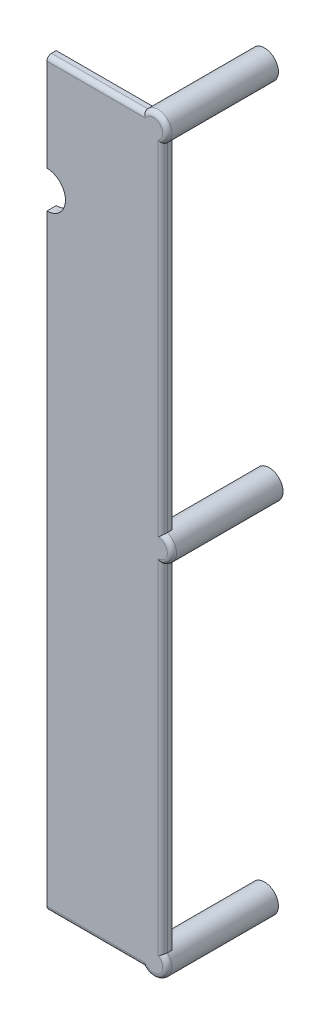
ISO-10303-21;
HEADER;
FILE_DESCRIPTION(('STEP AP214'),'2;1');
FILE_NAME('part.step','',(''),(''),'','','');
FILE_SCHEMA(('AUTOMOTIVE_DESIGN { 1 0 10303 214 1 1 1 1 }'));
ENDSEC;
DATA;
#1=APPLICATION_CONTEXT('core data for automotive mechanical design processes');
#2=APPLICATION_PROTOCOL_DEFINITION('international standard','automotive_design',2000,#1);
#3=PRODUCT_CONTEXT('',#1,'mechanical');
#4=PRODUCT('Part','Part','',(#3));
#5=PRODUCT_RELATED_PRODUCT_CATEGORY('part','',(#4));
#6=PRODUCT_DEFINITION_FORMATION('','',#4);
#7=PRODUCT_DEFINITION_CONTEXT('part definition',#1,'design');
#8=PRODUCT_DEFINITION('design','',#6,#7);
#9=PRODUCT_DEFINITION_SHAPE('','',#8);
#10=(LENGTH_UNIT() NAMED_UNIT(*) SI_UNIT(.MILLI.,.METRE.));
#11=(NAMED_UNIT(*) PLANE_ANGLE_UNIT() SI_UNIT($,.RADIAN.));
#12=(NAMED_UNIT(*) SI_UNIT($,.STERADIAN.) SOLID_ANGLE_UNIT());
#13=UNCERTAINTY_MEASURE_WITH_UNIT(LENGTH_MEASURE(1.E-05),#10,'distance_accuracy_value','');
#14=(GEOMETRIC_REPRESENTATION_CONTEXT(3) GLOBAL_UNCERTAINTY_ASSIGNED_CONTEXT((#13)) GLOBAL_UNIT_ASSIGNED_CONTEXT((#10,
#11,#12)) REPRESENTATION_CONTEXT('',''));
#15=CARTESIAN_POINT('',(0.,0.,0.));
#16=DIRECTION('',(0.,0.,1.));
#17=DIRECTION('',(1.,0.,0.));
#18=AXIS2_PLACEMENT_3D('',#15,#16,#17);
#19=CARTESIAN_POINT('',(2.,2.,50.));
#20=DIRECTION('',(0.,0.,1.));
#21=DIRECTION('',(1.,0.,0.));
#22=AXIS2_PLACEMENT_3D('',#19,#20,#21);
#23=PLANE('',#22);
#24=DIRECTION('',(1.,0.,0.));
#25=VECTOR('',#24,1.);
#26=CARTESIAN_POINT('',(0.,0.,50.));
#27=LINE('',#26,#25);
#28=CARTESIAN_POINT('',(25.,0.,50.));
#29=VERTEX_POINT('',#28);
#30=CARTESIAN_POINT('',(45.7639320225002,0.,50.));
#31=VERTEX_POINT('',#30);
#32=EDGE_CURVE('E238',#29,#31,#27,.T.);
#33=ORIENTED_EDGE('',*,*,#32,.F.);
#34=DIRECTION('',(0.,1.,0.));
#35=VECTOR('',#34,1.);
#36=CARTESIAN_POINT('',(25.,2.,50.));
#37=LINE('',#36,#35);
#38=CARTESIAN_POINT('',(25.,131.,50.));
#39=VERTEX_POINT('',#38);
#40=EDGE_CURVE('E222',#29,#39,#37,.T.);
#41=ORIENTED_EDGE('',*,*,#40,.T.);
#42=CARTESIAN_POINT('',(25.,135.,50.));
#43=DIRECTION('',(0.,0.,1.));
#44=DIRECTION('',(1.,0.,0.));
#45=AXIS2_PLACEMENT_3D('',#42,#43,#44);
#46=CIRCLE('',#45,4.);
#47=CARTESIAN_POINT('',(25.,139.,50.));
#48=VERTEX_POINT('',#47);
#49=EDGE_CURVE('E236',#39,#48,#46,.T.);
#50=ORIENTED_EDGE('',*,*,#49,.T.);
#51=CARTESIAN_POINT('',(25.,160.,50.));
#52=VERTEX_POINT('',#51);
#53=EDGE_CURVE('E241',#48,#52,#37,.T.);
#54=ORIENTED_EDGE('',*,*,#53,.T.);
#55=DIRECTION('',(-1.,0.,0.));
#56=VECTOR('',#55,1.);
#57=CARTESIAN_POINT('',(0.,160.,50.));
#58=LINE('',#57,#56);
#59=CARTESIAN_POINT('',(45.7639320225002,160.,50.));
#60=VERTEX_POINT('',#59);
#61=EDGE_CURVE('E275',#60,#52,#58,.T.);
#62=ORIENTED_EDGE('',*,*,#61,.F.);
#63=CARTESIAN_POINT('',(48.,158.,50.));
#64=DIRECTION('',(0.,0.,-1.));
#65=DIRECTION('',(-1.,0.,0.));
#66=AXIS2_PLACEMENT_3D('',#63,#64,#65);
#67=CIRCLE('',#66,2.99999999999999);
#68=CARTESIAN_POINT('',(50.,155.7639320225,50.));
#69=VERTEX_POINT('',#68);
#70=EDGE_CURVE('E260',#69,#60,#67,.T.);
#71=ORIENTED_EDGE('',*,*,#70,.F.);
#72=DIRECTION('',(0.,1.,0.));
#73=VECTOR('',#72,1.);
#74=CARTESIAN_POINT('',(50.,0.,50.));
#75=LINE('',#74,#73);
#76=CARTESIAN_POINT('',(50.,82.8284271247462,50.));
#77=VERTEX_POINT('',#76);
#78=EDGE_CURVE('E272',#77,#69,#75,.T.);
#79=ORIENTED_EDGE('',*,*,#78,.F.);
#80=CARTESIAN_POINT('',(49.,80.,50.));
#81=DIRECTION('',(0.,0.,-1.));
#82=DIRECTION('',(-1.,0.,0.));
#83=AXIS2_PLACEMENT_3D('',#80,#81,#82);
#84=CIRCLE('',#83,3.);
#85=CARTESIAN_POINT('',(50.,77.1715728752538,50.));
#86=VERTEX_POINT('',#85);
#87=EDGE_CURVE('E255',#86,#77,#84,.T.);
#88=ORIENTED_EDGE('',*,*,#87,.F.);
#89=DIRECTION('',(0.,1.,0.));
#90=VECTOR('',#89,1.);
#91=CARTESIAN_POINT('',(50.,0.,50.));
#92=LINE('',#91,#90);
#93=CARTESIAN_POINT('',(50.,4.23606797749979,50.));
#94=VERTEX_POINT('',#93);
#95=EDGE_CURVE('E269',#94,#86,#92,.T.);
#96=ORIENTED_EDGE('',*,*,#95,.F.);
#97=CARTESIAN_POINT('',(48.,2.,50.));
#98=DIRECTION('',(0.,0.,-1.));
#99=DIRECTION('',(-1.,0.,0.));
#100=AXIS2_PLACEMENT_3D('',#97,#98,#99);
#101=CIRCLE('',#100,3.);
#102=EDGE_CURVE('E244',#31,#94,#101,.T.);
#103=ORIENTED_EDGE('',*,*,#102,.F.);
#104=EDGE_LOOP('',(#33,#41,#50,#54,#62,#71,#79,#88,#96,#103));
#105=FACE_BOUND('',#104,.T.);
#106=ADVANCED_FACE('F112',(#105),#23,.F.);
#107=CARTESIAN_POINT('',(2.,2.,52.));
#108=DIRECTION('',(0.,0.,1.));
#109=DIRECTION('',(1.,0.,0.));
#110=AXIS2_PLACEMENT_3D('',#107,#108,#109);
#111=PLANE('',#110);
#112=DIRECTION('',(0.,1.,0.));
#113=VECTOR('',#112,1.);
#114=CARTESIAN_POINT('',(25.,2.,52.));
#115=LINE('',#114,#113);
#116=CARTESIAN_POINT('',(25.,1.,52.));
#117=VERTEX_POINT('',#116);
#118=CARTESIAN_POINT('',(25.,131.,52.));
#119=VERTEX_POINT('',#118);
#120=EDGE_CURVE('E225',#117,#119,#115,.T.);
#121=ORIENTED_EDGE('',*,*,#120,.F.);
#122=DIRECTION('',(1.,0.,0.));
#123=VECTOR('',#122,1.);
#124=CARTESIAN_POINT('',(45.7639320225002,1.,52.));
#125=LINE('',#124,#123);
#126=CARTESIAN_POINT('',(46.2679491924311,1.,52.));
#127=VERTEX_POINT('',#126);
#128=EDGE_CURVE('E305',#117,#127,#125,.T.);
#129=ORIENTED_EDGE('',*,*,#128,.T.);
#130=CARTESIAN_POINT('',(48.,2.,52.));
#131=DIRECTION('',(0.,0.,1.));
#132=DIRECTION('',(1.,0.,0.));
#133=AXIS2_PLACEMENT_3D('',#130,#131,#132);
#134=CIRCLE('',#133,2.);
#135=CARTESIAN_POINT('',(49.,3.73205080756888,52.));
#136=VERTEX_POINT('',#135);
#137=EDGE_CURVE('E303',#127,#136,#134,.T.);
#138=ORIENTED_EDGE('',*,*,#137,.T.);
#139=DIRECTION('',(0.,1.,0.));
#140=VECTOR('',#139,1.);
#141=CARTESIAN_POINT('',(49.,77.1715728752538,52.));
#142=LINE('',#141,#140);
#143=CARTESIAN_POINT('',(49.,78.,52.));
#144=VERTEX_POINT('',#143);
#145=EDGE_CURVE('E301',#136,#144,#142,.T.);
#146=ORIENTED_EDGE('',*,*,#145,.T.);
#147=CARTESIAN_POINT('',(49.,80.,52.));
#148=DIRECTION('',(0.,0.,1.));
#149=DIRECTION('',(1.,0.,0.));
#150=AXIS2_PLACEMENT_3D('',#147,#148,#149);
#151=CIRCLE('',#150,2.);
#152=CARTESIAN_POINT('',(49.,82.,52.));
#153=VERTEX_POINT('',#152);
#154=EDGE_CURVE('E299',#144,#153,#151,.T.);
#155=ORIENTED_EDGE('',*,*,#154,.T.);
#156=DIRECTION('',(0.,1.,0.));
#157=VECTOR('',#156,1.);
#158=CARTESIAN_POINT('',(49.,155.7639320225,52.));
#159=LINE('',#158,#157);
#160=CARTESIAN_POINT('',(49.,156.267949192431,52.));
#161=VERTEX_POINT('',#160);
#162=EDGE_CURVE('E297',#153,#161,#159,.T.);
#163=ORIENTED_EDGE('',*,*,#162,.T.);
#164=CARTESIAN_POINT('',(48.,158.,52.));
#165=DIRECTION('',(0.,0.,1.));
#166=DIRECTION('',(1.,0.,0.));
#167=AXIS2_PLACEMENT_3D('',#164,#165,#166);
#168=CIRCLE('',#167,2.);
#169=CARTESIAN_POINT('',(46.2679491924311,159.,52.));
#170=VERTEX_POINT('',#169);
#171=EDGE_CURVE('E295',#161,#170,#168,.T.);
#172=ORIENTED_EDGE('',*,*,#171,.T.);
#173=DIRECTION('',(-1.,0.,0.));
#174=VECTOR('',#173,1.);
#175=CARTESIAN_POINT('',(25.,159.,52.));
#176=LINE('',#175,#174);
#177=CARTESIAN_POINT('',(25.,159.,52.));
#178=VERTEX_POINT('',#177);
#179=EDGE_CURVE('E293',#170,#178,#176,.T.);
#180=ORIENTED_EDGE('',*,*,#179,.T.);
#181=CARTESIAN_POINT('',(25.,139.,52.));
#182=VERTEX_POINT('',#181);
#183=EDGE_CURVE('E438',#182,#178,#115,.T.);
#184=ORIENTED_EDGE('',*,*,#183,.F.);
#185=CARTESIAN_POINT('',(25.,135.,52.));
#186=DIRECTION('',(0.,0.,1.));
#187=DIRECTION('',(1.,0.,0.));
#188=AXIS2_PLACEMENT_3D('',#185,#186,#187);
#189=CIRCLE('',#188,4.);
#190=EDGE_CURVE('E245',#119,#182,#189,.T.);
#191=ORIENTED_EDGE('',*,*,#190,.F.);
#192=EDGE_LOOP('',(#121,#129,#138,#146,#155,#163,#172,#180,#184,#191));
#193=FACE_BOUND('',#192,.T.);
#194=ADVANCED_FACE('F389',(#193),#111,.T.);
#195=CARTESIAN_POINT('',(0.,160.,50.));
#196=DIRECTION('',(0.,-1.,0.));
#197=DIRECTION('',(0.,0.,-1.));
#198=AXIS2_PLACEMENT_3D('',#195,#196,#197);
#199=PLANE('',#198);
#200=DIRECTION('',(0.,0.,1.));
#201=VECTOR('',#200,1.);
#202=CARTESIAN_POINT('',(25.,160.,50.));
#203=LINE('',#202,#201);
#204=CARTESIAN_POINT('',(25.,160.,51.));
#205=VERTEX_POINT('',#204);
#206=EDGE_CURVE('E250',#52,#205,#203,.T.);
#207=ORIENTED_EDGE('',*,*,#206,.T.);
#208=DIRECTION('',(-1.,0.,0.));
#209=VECTOR('',#208,1.);
#210=CARTESIAN_POINT('',(45.7639320225002,160.,51.));
#211=LINE('',#210,#209);
#212=CARTESIAN_POINT('',(45.7639320225002,160.,51.));
#213=VERTEX_POINT('',#212);
#214=EDGE_CURVE('E13',#205,#213,#211,.F.);
#215=ORIENTED_EDGE('',*,*,#214,.T.);
#216=DIRECTION('',(0.,0.,1.));
#217=VECTOR('',#216,1.);
#218=CARTESIAN_POINT('',(45.7639320225002,160.,0.));
#219=LINE('',#218,#217);
#220=EDGE_CURVE('E231',#213,#60,#219,.F.);
#221=ORIENTED_EDGE('',*,*,#220,.T.);
#222=ORIENTED_EDGE('',*,*,#61,.T.);
#223=EDGE_LOOP('',(#207,#215,#221,#222));
#224=FACE_BOUND('',#223,.T.);
#225=ADVANCED_FACE('F394',(#224),#199,.F.);
#226=CARTESIAN_POINT('',(0.,0.,50.));
#227=DIRECTION('',(0.,1.,0.));
#228=DIRECTION('',(0.,0.,1.));
#229=AXIS2_PLACEMENT_3D('',#226,#227,#228);
#230=PLANE('',#229);
#231=DIRECTION('',(0.,0.,1.));
#232=VECTOR('',#231,1.);
#233=CARTESIAN_POINT('',(45.7639320225002,0.,0.));
#234=LINE('',#233,#232);
#235=CARTESIAN_POINT('',(45.7639320225002,0.,51.));
#236=VERTEX_POINT('',#235);
#237=EDGE_CURVE('E278',#31,#236,#234,.T.);
#238=ORIENTED_EDGE('',*,*,#237,.T.);
#239=DIRECTION('',(1.,0.,0.));
#240=VECTOR('',#239,1.);
#241=CARTESIAN_POINT('',(25.,0.,51.));
#242=LINE('',#241,#240);
#243=CARTESIAN_POINT('',(25.,0.,51.));
#244=VERTEX_POINT('',#243);
#245=EDGE_CURVE('E308',#236,#244,#242,.F.);
#246=ORIENTED_EDGE('',*,*,#245,.T.);
#247=DIRECTION('',(0.,0.,-1.));
#248=VECTOR('',#247,1.);
#249=CARTESIAN_POINT('',(25.,0.,50.));
#250=LINE('',#249,#248);
#251=EDGE_CURVE('E239',#244,#29,#250,.T.);
#252=ORIENTED_EDGE('',*,*,#251,.T.);
#253=ORIENTED_EDGE('',*,*,#32,.T.);
#254=EDGE_LOOP('',(#238,#246,#252,#253));
#255=FACE_BOUND('',#254,.T.);
#256=ADVANCED_FACE('F416',(#255),#230,.F.);
#257=CARTESIAN_POINT('',(50.,0.,50.));
#258=DIRECTION('',(-1.,0.,0.));
#259=DIRECTION('',(0.,-1.,0.));
#260=AXIS2_PLACEMENT_3D('',#257,#258,#259);
#261=PLANE('',#260);
#262=DIRECTION('',(0.,0.,1.));
#263=VECTOR('',#262,1.);
#264=CARTESIAN_POINT('',(50.,77.1715728752538,0.));
#265=LINE('',#264,#263);
#266=CARTESIAN_POINT('',(50.,77.1715728752538,51.));
#267=VERTEX_POINT('',#266);
#268=EDGE_CURVE('E285',#86,#267,#265,.T.);
#269=ORIENTED_EDGE('',*,*,#268,.T.);
#270=DIRECTION('',(0.,1.,0.));
#271=VECTOR('',#270,1.);
#272=CARTESIAN_POINT('',(50.,4.23606797749979,51.));
#273=LINE('',#272,#271);
#274=CARTESIAN_POINT('',(50.,4.23606797749979,51.));
#275=VERTEX_POINT('',#274);
#276=EDGE_CURVE('E314',#267,#275,#273,.F.);
#277=ORIENTED_EDGE('',*,*,#276,.T.);
#278=DIRECTION('',(0.,0.,1.));
#279=VECTOR('',#278,1.);
#280=CARTESIAN_POINT('',(50.,4.23606797749979,0.));
#281=LINE('',#280,#279);
#282=EDGE_CURVE('E281',#275,#94,#281,.F.);
#283=ORIENTED_EDGE('',*,*,#282,.T.);
#284=ORIENTED_EDGE('',*,*,#95,.T.);
#285=EDGE_LOOP('',(#269,#277,#283,#284));
#286=FACE_BOUND('',#285,.T.);
#287=ADVANCED_FACE('F403',(#286),#261,.F.);
#288=CARTESIAN_POINT('',(48.,2.,0.));
#289=DIRECTION('',(0.,0.,1.));
#290=DIRECTION('',(1.,0.,0.));
#291=AXIS2_PLACEMENT_3D('',#288,#289,#290);
#292=CYLINDRICAL_SURFACE('',#291,3.);
#293=ORIENTED_EDGE('',*,*,#282,.F.);
#294=CARTESIAN_POINT('',(48.,2.,51.));
#295=DIRECTION('',(0.,0.,1.));
#296=DIRECTION('',(1.,0.,0.));
#297=AXIS2_PLACEMENT_3D('',#294,#295,#296);
#298=CIRCLE('',#297,3.);
#299=EDGE_CURVE('E312',#275,#236,#298,.F.);
#300=ORIENTED_EDGE('',*,*,#299,.T.);
#301=ORIENTED_EDGE('',*,*,#237,.F.);
#302=ORIENTED_EDGE('',*,*,#102,.T.);
#303=EDGE_LOOP('',(#293,#300,#301,#302));
#304=FACE_BOUND('',#303,.T.);
#305=CARTESIAN_POINT('',(48.,2.,28.));
#306=DIRECTION('',(0.,0.,-1.));
#307=DIRECTION('',(-1.,0.,0.));
#308=AXIS2_PLACEMENT_3D('',#305,#306,#307);
#309=CIRCLE('',#308,3.);
#310=CARTESIAN_POINT('',(45.,2.,28.));
#311=VERTEX_POINT('',#310);
#312=EDGE_CURVE('E248',#311,#311,#309,.T.);
#313=ORIENTED_EDGE('',*,*,#312,.F.);
#314=EDGE_LOOP('',(#313));
#315=FACE_BOUND('',#314,.T.);
#316=ADVANCED_FACE('F399',(#304,#315),#292,.T.);
#317=DIRECTION('',(0.,0.,1.));
#318=VECTOR('',#317,1.);
#319=CARTESIAN_POINT('',(50.,155.7639320225,0.));
#320=LINE('',#319,#318);
#321=CARTESIAN_POINT('',(50.,155.7639320225,51.));
#322=VERTEX_POINT('',#321);
#323=EDGE_CURVE('E288',#69,#322,#320,.T.);
#324=ORIENTED_EDGE('',*,*,#323,.T.);
#325=DIRECTION('',(0.,1.,0.));
#326=VECTOR('',#325,1.);
#327=CARTESIAN_POINT('',(50.,82.8284271247462,51.));
#328=LINE('',#327,#326);
#329=CARTESIAN_POINT('',(50.,82.8284271247462,51.));
#330=VERTEX_POINT('',#329);
#331=EDGE_CURVE('E318',#322,#330,#328,.F.);
#332=ORIENTED_EDGE('',*,*,#331,.T.);
#333=DIRECTION('',(0.,0.,1.));
#334=VECTOR('',#333,1.);
#335=CARTESIAN_POINT('',(50.,82.8284271247462,0.));
#336=LINE('',#335,#334);
#337=EDGE_CURVE('E283',#330,#77,#336,.F.);
#338=ORIENTED_EDGE('',*,*,#337,.T.);
#339=ORIENTED_EDGE('',*,*,#78,.T.);
#340=EDGE_LOOP('',(#324,#332,#338,#339));
#341=FACE_BOUND('',#340,.T.);
#342=ADVANCED_FACE('F402',(#341),#261,.F.);
#343=CARTESIAN_POINT('',(49.,80.,0.));
#344=DIRECTION('',(0.,0.,1.));
#345=DIRECTION('',(1.,0.,0.));
#346=AXIS2_PLACEMENT_3D('',#343,#344,#345);
#347=CYLINDRICAL_SURFACE('',#346,3.);
#348=ORIENTED_EDGE('',*,*,#337,.F.);
#349=CARTESIAN_POINT('',(49.,80.,51.));
#350=DIRECTION('',(0.,0.,1.));
#351=DIRECTION('',(1.,0.,0.));
#352=AXIS2_PLACEMENT_3D('',#349,#350,#351);
#353=CIRCLE('',#352,3.);
#354=EDGE_CURVE('E316',#330,#267,#353,.F.);
#355=ORIENTED_EDGE('',*,*,#354,.T.);
#356=ORIENTED_EDGE('',*,*,#268,.F.);
#357=ORIENTED_EDGE('',*,*,#87,.T.);
#358=EDGE_LOOP('',(#348,#355,#356,#357));
#359=FACE_BOUND('',#358,.T.);
#360=CARTESIAN_POINT('',(49.,80.,28.));
#361=DIRECTION('',(0.,0.,-1.));
#362=DIRECTION('',(-1.,0.,0.));
#363=AXIS2_PLACEMENT_3D('',#360,#361,#362);
#364=CIRCLE('',#363,3.);
#365=CARTESIAN_POINT('',(46.,80.,28.));
#366=VERTEX_POINT('',#365);
#367=EDGE_CURVE('E257',#366,#366,#364,.T.);
#368=ORIENTED_EDGE('',*,*,#367,.F.);
#369=EDGE_LOOP('',(#368));
#370=FACE_BOUND('',#369,.T.);
#371=ADVANCED_FACE('F405',(#359,#370),#347,.T.);
#372=CARTESIAN_POINT('',(48.,158.,0.));
#373=DIRECTION('',(0.,0.,1.));
#374=DIRECTION('',(1.,0.,0.));
#375=AXIS2_PLACEMENT_3D('',#372,#373,#374);
#376=CYLINDRICAL_SURFACE('',#375,3.);
#377=ORIENTED_EDGE('',*,*,#220,.F.);
#378=CARTESIAN_POINT('',(48.,158.,51.));
#379=DIRECTION('',(0.,0.,1.));
#380=DIRECTION('',(1.,0.,0.));
#381=AXIS2_PLACEMENT_3D('',#378,#379,#380);
#382=CIRCLE('',#381,3.);
#383=EDGE_CURVE('E320',#213,#322,#382,.F.);
#384=ORIENTED_EDGE('',*,*,#383,.T.);
#385=ORIENTED_EDGE('',*,*,#323,.F.);
#386=ORIENTED_EDGE('',*,*,#70,.T.);
#387=EDGE_LOOP('',(#377,#384,#385,#386));
#388=FACE_BOUND('',#387,.T.);
#389=CARTESIAN_POINT('',(48.,158.,28.));
#390=DIRECTION('',(0.,0.,-1.));
#391=DIRECTION('',(-1.,0.,0.));
#392=AXIS2_PLACEMENT_3D('',#389,#390,#391);
#393=CIRCLE('',#392,2.99999999999999);
#394=CARTESIAN_POINT('',(45.,158.,28.));
#395=VERTEX_POINT('',#394);
#396=EDGE_CURVE('E263',#395,#395,#393,.T.);
#397=ORIENTED_EDGE('',*,*,#396,.F.);
#398=EDGE_LOOP('',(#397));
#399=FACE_BOUND('',#398,.T.);
#400=ADVANCED_FACE('F408',(#388,#399),#376,.T.);
#401=CARTESIAN_POINT('',(48.,158.,28.));
#402=DIRECTION('',(0.,0.,-1.));
#403=DIRECTION('',(-1.,0.,0.));
#404=AXIS2_PLACEMENT_3D('',#401,#402,#403);
#405=PLANE('',#404);
#406=ORIENTED_EDGE('',*,*,#396,.T.);
#407=EDGE_LOOP('',(#406));
#408=FACE_BOUND('',#407,.T.);
#409=ADVANCED_FACE('F412',(#408),#405,.T.);
#410=CARTESIAN_POINT('',(49.,80.,28.));
#411=DIRECTION('',(0.,0.,-1.));
#412=DIRECTION('',(-1.,0.,0.));
#413=AXIS2_PLACEMENT_3D('',#410,#411,#412);
#414=PLANE('',#413);
#415=ORIENTED_EDGE('',*,*,#367,.T.);
#416=EDGE_LOOP('',(#415));
#417=FACE_BOUND('',#416,.T.);
#418=ADVANCED_FACE('F468',(#417),#414,.T.);
#419=CARTESIAN_POINT('',(48.,2.,28.));
#420=DIRECTION('',(0.,0.,-1.));
#421=DIRECTION('',(-1.,0.,0.));
#422=AXIS2_PLACEMENT_3D('',#419,#420,#421);
#423=PLANE('',#422);
#424=ORIENTED_EDGE('',*,*,#312,.T.);
#425=EDGE_LOOP('',(#424));
#426=FACE_BOUND('',#425,.T.);
#427=ADVANCED_FACE('F466',(#426),#423,.T.);
#428=CARTESIAN_POINT('',(25.,135.,30.));
#429=DIRECTION('',(0.,0.,1.));
#430=DIRECTION('',(1.,0.,0.));
#431=AXIS2_PLACEMENT_3D('',#428,#429,#430);
#432=CYLINDRICAL_SURFACE('',#431,4.);
#433=ORIENTED_EDGE('',*,*,#190,.T.);
#434=DIRECTION('',(0.,0.,1.));
#435=VECTOR('',#434,1.);
#436=CARTESIAN_POINT('',(25.,139.,30.));
#437=LINE('',#436,#435);
#438=EDGE_CURVE('E230',#182,#48,#437,.F.);
#439=ORIENTED_EDGE('',*,*,#438,.T.);
#440=ORIENTED_EDGE('',*,*,#49,.F.);
#441=DIRECTION('',(0.,0.,1.));
#442=VECTOR('',#441,1.);
#443=CARTESIAN_POINT('',(25.,131.,30.));
#444=LINE('',#443,#442);
#445=EDGE_CURVE('E218',#39,#119,#444,.T.);
#446=ORIENTED_EDGE('',*,*,#445,.T.);
#447=EDGE_LOOP('',(#433,#439,#440,#446));
#448=FACE_BOUND('',#447,.T.);
#449=ADVANCED_FACE('F243',(#448),#432,.F.);
#450=CARTESIAN_POINT('',(25.,0.,0.));
#451=DIRECTION('',(1.,0.,0.));
#452=DIRECTION('',(0.,0.,-1.));
#453=AXIS2_PLACEMENT_3D('',#450,#451,#452);
#454=PLANE('',#453);
#455=ORIENTED_EDGE('',*,*,#251,.F.);
#456=CARTESIAN_POINT('',(25.,1.,51.));
#457=DIRECTION('',(1.,0.,0.));
#458=DIRECTION('',(0.,0.,-1.));
#459=AXIS2_PLACEMENT_3D('',#456,#457,#458);
#460=CIRCLE('',#459,1.);
#461=EDGE_CURVE('E310',#244,#117,#460,.F.);
#462=ORIENTED_EDGE('',*,*,#461,.T.);
#463=ORIENTED_EDGE('',*,*,#120,.T.);
#464=ORIENTED_EDGE('',*,*,#445,.F.);
#465=ORIENTED_EDGE('',*,*,#40,.F.);
#466=EDGE_LOOP('',(#455,#462,#463,#464,#465));
#467=FACE_BOUND('',#466,.T.);
#468=ADVANCED_FACE('F221',(#467),#454,.F.);
#469=ORIENTED_EDGE('',*,*,#183,.T.);
#470=CARTESIAN_POINT('',(25.,159.,51.));
#471=DIRECTION('',(1.,0.,0.));
#472=DIRECTION('',(0.,0.,-1.));
#473=AXIS2_PLACEMENT_3D('',#470,#471,#472);
#474=CIRCLE('',#473,1.);
#475=EDGE_CURVE('E126',#178,#205,#474,.F.);
#476=ORIENTED_EDGE('',*,*,#475,.T.);
#477=ORIENTED_EDGE('',*,*,#206,.F.);
#478=ORIENTED_EDGE('',*,*,#53,.F.);
#479=ORIENTED_EDGE('',*,*,#438,.F.);
#480=EDGE_LOOP('',(#469,#476,#477,#478,#479));
#481=FACE_BOUND('',#480,.T.);
#482=ADVANCED_FACE('F385',(#481),#454,.F.);
#483=CARTESIAN_POINT('',(2.,159.,51.));
#484=DIRECTION('',(1.,0.,0.));
#485=DIRECTION('',(0.,0.,-1.));
#486=AXIS2_PLACEMENT_3D('',#483,#484,#485);
#487=CYLINDRICAL_SURFACE('',#486,1.);
#488=ORIENTED_EDGE('',*,*,#475,.F.);
#489=ORIENTED_EDGE('',*,*,#179,.F.);
#490=CARTESIAN_POINT('',(45.7639320225002,160.,51.));
#491=CARTESIAN_POINT('',(45.7639320604341,160.000000958065,51.0262761337896));
#492=CARTESIAN_POINT('',(45.7643954653066,159.998963594621,51.0525391008307));
#493=CARTESIAN_POINT('',(45.7662437911484,159.994832769189,51.1048650273615));
#494=CARTESIAN_POINT('',(45.7676285295438,159.991739714561,51.1309280254427));
#495=CARTESIAN_POINT('',(45.7731437209855,159.979437259157,51.2083830396057));
#496=CARTESIAN_POINT('',(45.7786352500045,159.967204222097,51.2592356513197));
#497=CARTESIAN_POINT('',(45.7930940256683,159.935191179809,51.3579286158092));
#498=CARTESIAN_POINT('',(45.8020604236743,159.915413017284,51.4057697007518));
#499=CARTESIAN_POINT('',(45.8232346035508,159.869097882473,51.4972922287611));
#500=CARTESIAN_POINT('',(45.8354435677077,159.842558445072,51.5409721466976));
#501=CARTESIAN_POINT('',(45.8632298816858,159.78279404117,51.6244598568639));
#502=CARTESIAN_POINT('',(45.8788992433551,159.749388631186,51.6641073334328));
#503=CARTESIAN_POINT('',(45.9130156993896,159.677606331068,51.737208255102));
#504=CARTESIAN_POINT('',(45.9314634930612,159.639228189682,51.7706601360866));
#505=CARTESIAN_POINT('',(45.9723585889953,159.555439589477,51.8333302696355));
#506=CARTESIAN_POINT('',(45.9950082882077,159.509711743303,51.8619910990095));
#507=CARTESIAN_POINT('',(46.0426910111536,159.415244967295,51.9112700455775));
#508=CARTESIAN_POINT('',(46.06772571428,159.366503924334,51.9318824426384));
#509=CARTESIAN_POINT('',(46.1204670340415,159.265964570219,51.9654804296597));
#510=CARTESIAN_POINT('',(46.1482290868317,159.214118805714,51.9782345742394));
#511=CARTESIAN_POINT('',(46.2053298882945,159.110014229645,51.9953251013182));
#512=CARTESIAN_POINT('',(46.2346656322862,159.057756357059,51.999676977027));
#513=CARTESIAN_POINT('',(46.2656846781371,159.003924167277,51.9999942395109));
#514=CARTESIAN_POINT('',(46.266816546879,159.001961787951,52.0000000133747));
#515=CARTESIAN_POINT('',(46.2679491924311,159.,52.));
#516=B_SPLINE_CURVE_WITH_KNOTS('',3,(#490,#491,#492,#493,#494,#495,#496,#497,#498,#499,#500,
#501,#502,#503,#504,#505,#506,#507,#508,#509,#510,#511,#512,#513,#514,#515),.UNSPECIFIED.,.F.,
.F.,(4,2,2,2,2,2,2,2,2,2,2,2,4),(0.,0.0787779861353127,0.157540366072871,0.314489126943972,
0.471399581629592,0.62836732686311,0.790160530661905,0.951994524623876,1.12685345558583,
1.30183643600641,1.48175349087443,1.66133847295152,1.66813467263543),.UNSPECIFIED.);
#517=EDGE_CURVE('E117',#213,#170,#516,.T.);
#518=ORIENTED_EDGE('',*,*,#517,.F.);
#519=ORIENTED_EDGE('',*,*,#214,.F.);
#520=EDGE_LOOP('',(#488,#489,#518,#519));
#521=FACE_BOUND('',#520,.T.);
#522=ADVANCED_FACE('F114',(#521),#487,.T.);
#523=CARTESIAN_POINT('',(48.,158.,51.));
#524=DIRECTION('',(0.,0.,1.));
#525=DIRECTION('',(1.,0.,0.));
#526=AXIS2_PLACEMENT_3D('',#523,#524,#525);
#527=TOROIDAL_SURFACE('',#526,2.,1.);
#528=ORIENTED_EDGE('',*,*,#517,.T.);
#529=ORIENTED_EDGE('',*,*,#171,.F.);
#530=CARTESIAN_POINT('',(50.,155.7639320225,51.));
#531=CARTESIAN_POINT('',(50.0000009580645,155.763932060434,51.0262761337896));
#532=CARTESIAN_POINT('',(49.9989635946214,155.764395465307,51.0525391008307));
#533=CARTESIAN_POINT('',(49.994832769189,155.766243791148,51.1048650273615));
#534=CARTESIAN_POINT('',(49.9917397145608,155.767628529544,51.1309280254427));
#535=CARTESIAN_POINT('',(49.9794372591566,155.773143720985,51.2083830396057));
#536=CARTESIAN_POINT('',(49.9672042220966,155.778635250004,51.2592356513197));
#537=CARTESIAN_POINT('',(49.9351911798088,155.793094025668,51.3579286158092));
#538=CARTESIAN_POINT('',(49.9154130172839,155.802060423674,51.4057697007518));
#539=CARTESIAN_POINT('',(49.8690978824727,155.823234603551,51.4972922287611));
#540=CARTESIAN_POINT('',(49.8425584450721,155.835443567708,51.5409721466976));
#541=CARTESIAN_POINT('',(49.7827940411702,155.863229881686,51.6244598568639));
#542=CARTESIAN_POINT('',(49.7493886311864,155.878899243355,51.6641073334328));
#543=CARTESIAN_POINT('',(49.6776063310678,155.91301569939,51.737208255102));
#544=CARTESIAN_POINT('',(49.6392281896817,155.931463493061,51.7706601360866));
#545=CARTESIAN_POINT('',(49.5554395894771,155.972358588995,51.8333302696355));
#546=CARTESIAN_POINT('',(49.5097117433026,155.995008288208,51.8619910990095));
#547=CARTESIAN_POINT('',(49.4152449672946,156.042691011154,51.9112700455775));
#548=CARTESIAN_POINT('',(49.3665039243343,156.06772571428,51.9318824426384));
#549=CARTESIAN_POINT('',(49.2659645702194,156.120467034042,51.9654804296597));
#550=CARTESIAN_POINT('',(49.214118805714,156.148229086832,51.9782345742394));
#551=CARTESIAN_POINT('',(49.1100142296444,156.205329888294,51.9953251013182));
#552=CARTESIAN_POINT('',(49.0577563570591,156.234665632286,51.999676977027));
#553=CARTESIAN_POINT('',(49.003924167277,156.265684678137,51.9999942395109));
#554=CARTESIAN_POINT('',(49.0019617879505,156.266816546879,52.0000000133747));
#555=CARTESIAN_POINT('',(49.,156.267949192431,52.));
#556=B_SPLINE_CURVE_WITH_KNOTS('',3,(#530,#531,#532,#533,#534,#535,#536,#537,#538,#539,#540,
#541,#542,#543,#544,#545,#546,#547,#548,#549,#550,#551,#552,#553,#554,#555),.UNSPECIFIED.,.F.,
.F.,(4,2,2,2,2,2,2,2,2,2,2,2,4),(0.,0.0787779861353124,0.157540366072871,0.314489126943974,
0.471399581629581,0.628367326863114,0.790160530661896,0.951994524623855,1.12685345558582,
1.30183643600642,1.48175349087445,1.66133847295157,1.66813467263543),.UNSPECIFIED.);
#557=EDGE_CURVE('E367',#322,#161,#556,.T.);
#558=ORIENTED_EDGE('',*,*,#557,.F.);
#559=ORIENTED_EDGE('',*,*,#383,.F.);
#560=EDGE_LOOP('',(#528,#529,#558,#559));
#561=FACE_BOUND('',#560,.T.);
#562=ADVANCED_FACE('F375',(#561),#527,.T.);
#563=CARTESIAN_POINT('',(49.,2.00000000000001,51.));
#564=DIRECTION('',(0.,-1.,0.));
#565=DIRECTION('',(1.,0.,0.));
#566=AXIS2_PLACEMENT_3D('',#563,#564,#565);
#567=CYLINDRICAL_SURFACE('',#566,1.);
#568=ORIENTED_EDGE('',*,*,#557,.T.);
#569=ORIENTED_EDGE('',*,*,#162,.F.);
#570=CARTESIAN_POINT('',(50.,82.8284271247462,51.));
#571=CARTESIAN_POINT('',(50.0000019220974,82.8284278051751,51.0242718999699));
#572=CARTESIAN_POINT('',(49.9991155810892,82.8278018147085,51.0485307937647));
#573=CARTESIAN_POINT('',(49.9955936657635,82.8253100695965,51.0968480931946));
#574=CARTESIAN_POINT('',(49.9929587567074,82.823444786453,51.1209065715565));
#575=CARTESIAN_POINT('',(49.9825114637129,82.8160382716308,51.1922716291847));
#576=CARTESIAN_POINT('',(49.9721557986533,82.8086859924729,51.2390520380716));
#577=CARTESIAN_POINT('',(49.9452647541318,82.7894712423128,51.3297171723663));
#578=CARTESIAN_POINT('',(49.9287359572227,82.7776135752766,51.3736049238434));
#579=CARTESIAN_POINT('',(49.8903443098408,82.7498308736148,51.4576272846555));
#580=CARTESIAN_POINT('',(49.8684762137914,82.7339018383619,51.4977581490814));
#581=CARTESIAN_POINT('',(49.8190368431563,82.6974981043507,51.5756970806461));
#582=CARTESIAN_POINT('',(49.7912145039031,82.6768185769533,51.6132486649265));
#583=CARTESIAN_POINT('',(49.7318590207812,82.6320973387533,51.6829947687106));
#584=CARTESIAN_POINT('',(49.700325227453,82.6080550393673,51.7151883482418));
#585=CARTESIAN_POINT('',(49.6291501922983,82.5529352093596,51.7789829688021));
#586=CARTESIAN_POINT('',(49.5890297472403,82.5213514243197,51.8096096817468));
#587=CARTESIAN_POINT('',(49.5065373501644,82.4550465492277,51.8636305132498));
#588=CARTESIAN_POINT('',(49.4641622358244,82.4203210021765,51.8870141418967));
#589=CARTESIAN_POINT('',(49.3521413626216,82.3263515895079,51.9390417972051));
#590=CARTESIAN_POINT('',(49.2816302882741,82.2650743851552,51.9621917157338));
#591=CARTESIAN_POINT('',(49.1416286279572,82.1378872683534,51.9925082317313));
#592=CARTESIAN_POINT('',(49.0721372932866,82.0719809839573,51.9996872054044));
#593=CARTESIAN_POINT('',(49.002982194285,82.0029805374285,51.9999966672879));
#594=CARTESIAN_POINT('',(49.0014906450813,82.0014906552269,52.0000000004368));
#595=CARTESIAN_POINT('',(49.,82.,52.));
#596=B_SPLINE_CURVE_WITH_KNOTS('',3,(#570,#571,#572,#573,#574,#575,#576,#577,#578,#579,#580,
#581,#582,#583,#584,#585,#586,#587,#588,#589,#590,#591,#592,#593,#594,#595),.UNSPECIFIED.,.F.,
.F.,(4,2,2,2,2,2,2,2,2,2,2,2,4),(0.,0.0727662358341405,0.14550480284219,0.290141264139485,
0.434623934555062,0.579249126723425,0.731985115133287,0.884747870344656,1.06271769267388,
1.24094407033486,1.52790311157198,1.81463970494203,1.82096426917183),.UNSPECIFIED.);
#597=EDGE_CURVE('E361',#330,#153,#596,.T.);
#598=ORIENTED_EDGE('',*,*,#597,.F.);
#599=ORIENTED_EDGE('',*,*,#331,.F.);
#600=EDGE_LOOP('',(#568,#569,#598,#599));
#601=FACE_BOUND('',#600,.T.);
#602=ADVANCED_FACE('F372',(#601),#567,.T.);
#603=CARTESIAN_POINT('',(49.,80.,51.));
#604=DIRECTION('',(0.,0.,1.));
#605=DIRECTION('',(1.,0.,0.));
#606=AXIS2_PLACEMENT_3D('',#603,#604,#605);
#607=TOROIDAL_SURFACE('',#606,2.,1.);
#608=ORIENTED_EDGE('',*,*,#597,.T.);
#609=ORIENTED_EDGE('',*,*,#154,.F.);
#610=CARTESIAN_POINT('',(50.,77.1715728752538,51.));
#611=CARTESIAN_POINT('',(50.0000019220974,77.1715721948249,51.0242718999699));
#612=CARTESIAN_POINT('',(49.9991155810892,77.1721981852916,51.0485307937647));
#613=CARTESIAN_POINT('',(49.9955936657635,77.1746899304035,51.0968480931946));
#614=CARTESIAN_POINT('',(49.9929587567074,77.176555213547,51.1209065715565));
#615=CARTESIAN_POINT('',(49.9825114637129,77.1839617283692,51.1922716291847));
#616=CARTESIAN_POINT('',(49.9721557986533,77.1913140075271,51.2390520380716));
#617=CARTESIAN_POINT('',(49.9452647541318,77.2105287576872,51.3297171723663));
#618=CARTESIAN_POINT('',(49.9287359572227,77.2223864247234,51.3736049238434));
#619=CARTESIAN_POINT('',(49.8903443098408,77.2501691263851,51.4576272846555));
#620=CARTESIAN_POINT('',(49.8684762137914,77.266098161638,51.4977581490814));
#621=CARTESIAN_POINT('',(49.8190368431563,77.3025018956493,51.5756970806461));
#622=CARTESIAN_POINT('',(49.7912145039031,77.3231814230468,51.6132486649265));
#623=CARTESIAN_POINT('',(49.7318590207812,77.3679026612467,51.6829947687106));
#624=CARTESIAN_POINT('',(49.700325227453,77.3919449606327,51.7151883482418));
#625=CARTESIAN_POINT('',(49.6291501922983,77.4470647906404,51.7789829688021));
#626=CARTESIAN_POINT('',(49.5890297472403,77.4786485756802,51.8096096817468));
#627=CARTESIAN_POINT('',(49.5065373501644,77.5449534507723,51.8636305132498));
#628=CARTESIAN_POINT('',(49.4641622358244,77.5796789978235,51.8870141418967));
#629=CARTESIAN_POINT('',(49.3521413626216,77.6736484104921,51.9390417972051));
#630=CARTESIAN_POINT('',(49.2816302882741,77.7349256148449,51.9621917157338));
#631=CARTESIAN_POINT('',(49.1416286279571,77.8621127316466,51.9925082317313));
#632=CARTESIAN_POINT('',(49.0721372932864,77.9280190160424,51.9996872054044));
#633=CARTESIAN_POINT('',(49.002982194285,77.9970194625715,51.9999966672879));
#634=CARTESIAN_POINT('',(49.0014906450813,77.9985093447731,52.0000000004368));
#635=CARTESIAN_POINT('',(49.,78.,52.));
#636=B_SPLINE_CURVE_WITH_KNOTS('',3,(#610,#611,#612,#613,#614,#615,#616,#617,#618,#619,#620,
#621,#622,#623,#624,#625,#626,#627,#628,#629,#630,#631,#632,#633,#634,#635),.UNSPECIFIED.,.F.,
.F.,(4,2,2,2,2,2,2,2,2,2,2,2,4),(0.,0.0727662358341408,0.145504802842189,0.290141264139483,
0.434623934555044,0.579249126723416,0.731985115133285,0.884747870344648,1.06271769267385,
1.24094407033487,1.52790311157199,1.81463970494204,1.82096426917183),.UNSPECIFIED.);
#637=EDGE_CURVE('E354',#267,#144,#636,.T.);
#638=ORIENTED_EDGE('',*,*,#637,.F.);
#639=ORIENTED_EDGE('',*,*,#354,.F.);
#640=EDGE_LOOP('',(#608,#609,#638,#639));
#641=FACE_BOUND('',#640,.T.);
#642=ADVANCED_FACE('F349',(#641),#607,.T.);
#643=CARTESIAN_POINT('',(49.,2.00000000000001,51.));
#644=DIRECTION('',(0.,-1.,0.));
#645=DIRECTION('',(1.,0.,0.));
#646=AXIS2_PLACEMENT_3D('',#643,#644,#645);
#647=CYLINDRICAL_SURFACE('',#646,1.);
#648=ORIENTED_EDGE('',*,*,#637,.T.);
#649=ORIENTED_EDGE('',*,*,#145,.F.);
#650=CARTESIAN_POINT('',(50.,4.23606797749979,51.));
#651=CARTESIAN_POINT('',(50.0000009580646,4.23606793956589,51.0262761337896));
#652=CARTESIAN_POINT('',(49.9989635946214,4.23560453469336,51.0525391008307));
#653=CARTESIAN_POINT('',(49.994832769189,4.23375620885164,51.1048650273615));
#654=CARTESIAN_POINT('',(49.9917397145609,4.23237147045623,51.1309280254427));
#655=CARTESIAN_POINT('',(49.9794372591567,4.22685627901452,51.2083830396057));
#656=CARTESIAN_POINT('',(49.9672042220967,4.22136474999554,51.2592356513197));
#657=CARTESIAN_POINT('',(49.9351911798089,4.20690597433168,51.3579286158092));
#658=CARTESIAN_POINT('',(49.915413017284,4.1979395763257,51.4057697007518));
#659=CARTESIAN_POINT('',(49.8690978824727,4.17676539644924,51.4972922287611));
#660=CARTESIAN_POINT('',(49.8425584450721,4.16455643229233,51.5409721466976));
#661=CARTESIAN_POINT('',(49.7827940411702,4.13677011831418,51.6244598568639));
#662=CARTESIAN_POINT('',(49.7493886311864,4.12110075664491,51.6641073334328));
#663=CARTESIAN_POINT('',(49.6776063310679,4.08698430061044,51.737208255102));
#664=CARTESIAN_POINT('',(49.6392281896818,4.06853650693879,51.7706601360866));
#665=CARTESIAN_POINT('',(49.5554395894771,4.02764141100474,51.8333302696355));
#666=CARTESIAN_POINT('',(49.5097117433027,4.00499171179226,51.8619910990095));
#667=CARTESIAN_POINT('',(49.4152449672946,3.9573089888464,51.9112700455775));
#668=CARTESIAN_POINT('',(49.3665039243344,3.93227428572006,51.9318824426384));
#669=CARTESIAN_POINT('',(49.2659645702194,3.87953296595845,51.9654804296597));
#670=CARTESIAN_POINT('',(49.214118805714,3.85177091316822,51.9782345742394));
#671=CARTESIAN_POINT('',(49.1100142296445,3.79467011170552,51.9953251013182));
#672=CARTESIAN_POINT('',(49.0577563570592,3.76533436771399,51.999676977027));
#673=CARTESIAN_POINT('',(49.003924167277,3.7343153218629,51.9999942395109));
#674=CARTESIAN_POINT('',(49.0019617879505,3.73318345312104,52.0000000133747));
#675=CARTESIAN_POINT('',(49.,3.73205080756888,52.));
#676=B_SPLINE_CURVE_WITH_KNOTS('',3,(#650,#651,#652,#653,#654,#655,#656,#657,#658,#659,#660,
#661,#662,#663,#664,#665,#666,#667,#668,#669,#670,#671,#672,#673,#674,#675),.UNSPECIFIED.,.F.,
.F.,(4,2,2,2,2,2,2,2,2,2,2,2,4),(0.,0.0787779861353122,0.157540366072871,0.314489126943975,
0.47139958162959,0.628367326863118,0.790160530661884,0.95199452462386,1.12685345558582,
1.30183643600642,1.48175349087446,1.66133847295155,1.66813467263543),.UNSPECIFIED.);
#677=EDGE_CURVE('E331',#275,#136,#676,.T.);
#678=ORIENTED_EDGE('',*,*,#677,.F.);
#679=ORIENTED_EDGE('',*,*,#276,.F.);
#680=EDGE_LOOP('',(#648,#649,#678,#679));
#681=FACE_BOUND('',#680,.T.);
#682=ADVANCED_FACE('F345',(#681),#647,.T.);
#683=CARTESIAN_POINT('',(48.,2.,51.));
#684=DIRECTION('',(0.,0.,1.));
#685=DIRECTION('',(1.,0.,0.));
#686=AXIS2_PLACEMENT_3D('',#683,#684,#685);
#687=TOROIDAL_SURFACE('',#686,2.,1.);
#688=ORIENTED_EDGE('',*,*,#677,.T.);
#689=ORIENTED_EDGE('',*,*,#137,.F.);
#690=CARTESIAN_POINT('',(45.7639320225002,0.,51.));
#691=CARTESIAN_POINT('',(45.7639320604341,-9.58064563949699E-07,51.0262761337896));
#692=CARTESIAN_POINT('',(45.7643954653066,0.00103640537860841,51.0525391008307));
#693=CARTESIAN_POINT('',(45.7662437911484,0.00516723081101616,51.1048650273615));
#694=CARTESIAN_POINT('',(45.7676285295438,0.00826028543914419,51.1309280254427));
#695=CARTESIAN_POINT('',(45.7731437209855,0.0205627408433205,51.2083830396057));
#696=CARTESIAN_POINT('',(45.7786352500045,0.032795777903333,51.2592356513197));
#697=CARTESIAN_POINT('',(45.7930940256683,0.0648088201911335,51.3579286158092));
#698=CARTESIAN_POINT('',(45.8020604236743,0.0845869827160452,51.4057697007518));
#699=CARTESIAN_POINT('',(45.8232346035508,0.13090211752729,51.4972922287611));
#700=CARTESIAN_POINT('',(45.8354435677077,0.157441554927891,51.5409721466976));
#701=CARTESIAN_POINT('',(45.8632298816858,0.21720595882981,51.6244598568639));
#702=CARTESIAN_POINT('',(45.8788992433551,0.250611368813579,51.6641073334328));
#703=CARTESIAN_POINT('',(45.9130156993896,0.322393668932148,51.737208255102));
#704=CARTESIAN_POINT('',(45.9314634930612,0.360771810318235,51.7706601360866));
#705=CARTESIAN_POINT('',(45.9723585889953,0.444560410522857,51.8333302696355));
#706=CARTESIAN_POINT('',(45.9950082882077,0.490288256697338,51.8619910990095));
#707=CARTESIAN_POINT('',(46.0426910111536,0.584755032705399,51.9112700455775));
#708=CARTESIAN_POINT('',(46.0677257142799,0.63349607566564,51.9318824426384));
#709=CARTESIAN_POINT('',(46.1204670340415,0.734035429780573,51.9654804296597));
#710=CARTESIAN_POINT('',(46.1482290868318,0.785881194285999,51.9782345742394));
#711=CARTESIAN_POINT('',(46.2053298882945,0.889985770355492,51.9953251013182));
#712=CARTESIAN_POINT('',(46.234665632286,0.942243642940776,51.999676977027));
#713=CARTESIAN_POINT('',(46.2656846781371,0.996075832722998,51.9999942395109));
#714=CARTESIAN_POINT('',(46.266816546879,0.998038212049475,52.0000000133747));
#715=CARTESIAN_POINT('',(46.2679491924311,1.,52.));
#716=B_SPLINE_CURVE_WITH_KNOTS('',3,(#690,#691,#692,#693,#694,#695,#696,#697,#698,#699,#700,
#701,#702,#703,#704,#705,#706,#707,#708,#709,#710,#711,#712,#713,#714,#715),.UNSPECIFIED.,.F.,
.F.,(4,2,2,2,2,2,2,2,2,2,2,2,4),(0.,0.0787779861353121,0.157540366072871,0.314489126943976,
0.47139958162959,0.628367326863118,0.790160530661895,0.951994524623867,1.12685345558582,
1.30183643600642,1.48175349087445,1.66133847295154,1.66813467263543),.UNSPECIFIED.);
#717=EDGE_CURVE('E323',#236,#127,#716,.T.);
#718=ORIENTED_EDGE('',*,*,#717,.F.);
#719=ORIENTED_EDGE('',*,*,#299,.F.);
#720=EDGE_LOOP('',(#688,#689,#718,#719));
#721=FACE_BOUND('',#720,.T.);
#722=ADVANCED_FACE('F338',(#721),#687,.T.);
#723=CARTESIAN_POINT('',(2.,1.,51.));
#724=DIRECTION('',(-1.,0.,0.));
#725=DIRECTION('',(0.,0.,1.));
#726=AXIS2_PLACEMENT_3D('',#723,#724,#725);
#727=CYLINDRICAL_SURFACE('',#726,1.);
#728=ORIENTED_EDGE('',*,*,#461,.F.);
#729=ORIENTED_EDGE('',*,*,#245,.F.);
#730=ORIENTED_EDGE('',*,*,#717,.T.);
#731=ORIENTED_EDGE('',*,*,#128,.F.);
#732=EDGE_LOOP('',(#728,#729,#730,#731));
#733=FACE_BOUND('',#732,.T.);
#734=ADVANCED_FACE('F341',(#733),#727,.T.);
#735=CLOSED_SHELL('',(#106,#194,#225,#256,#287,#316,#342,#371,#400,#409,#418,#427,#449,#468,
#482,#522,#562,#602,#642,#682,#722,#734));
#736=MANIFOLD_SOLID_BREP('B2',#735);
#737=ADVANCED_BREP_SHAPE_REPRESENTATION('',(#18,#736),#14);
#738=SHAPE_DEFINITION_REPRESENTATION(#9,#737);
ENDSEC;
END-ISO-10303-21;
